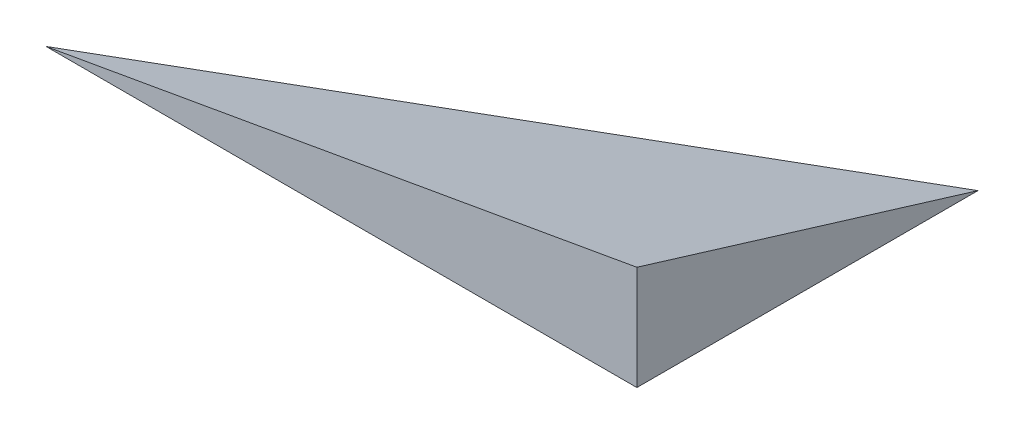
ISO-10303-21;
HEADER;
FILE_DESCRIPTION(('STEP AP214'),'2;1');
FILE_NAME('part.step','',(''),(''),'','','');
FILE_SCHEMA(('AUTOMOTIVE_DESIGN { 1 0 10303 214 1 1 1 1 }'));
ENDSEC;
DATA;
#1=APPLICATION_CONTEXT('core data for automotive mechanical design processes');
#2=APPLICATION_PROTOCOL_DEFINITION('international standard','automotive_design',2000,#1);
#3=PRODUCT_CONTEXT('',#1,'mechanical');
#4=PRODUCT('Part','Part','',(#3));
#5=PRODUCT_RELATED_PRODUCT_CATEGORY('part','',(#4));
#6=PRODUCT_DEFINITION_FORMATION('','',#4);
#7=PRODUCT_DEFINITION_CONTEXT('part definition',#1,'design');
#8=PRODUCT_DEFINITION('design','',#6,#7);
#9=PRODUCT_DEFINITION_SHAPE('','',#8);
#10=(LENGTH_UNIT() NAMED_UNIT(*) SI_UNIT(.MILLI.,.METRE.));
#11=(NAMED_UNIT(*) PLANE_ANGLE_UNIT() SI_UNIT($,.RADIAN.));
#12=(NAMED_UNIT(*) SI_UNIT($,.STERADIAN.) SOLID_ANGLE_UNIT());
#13=UNCERTAINTY_MEASURE_WITH_UNIT(LENGTH_MEASURE(1.E-05),#10,'distance_accuracy_value','');
#14=(GEOMETRIC_REPRESENTATION_CONTEXT(3) GLOBAL_UNCERTAINTY_ASSIGNED_CONTEXT((#13)) GLOBAL_UNIT_ASSIGNED_CONTEXT((#10,
#11,#12)) REPRESENTATION_CONTEXT('',''));
#15=CARTESIAN_POINT('',(0.,0.,0.));
#16=DIRECTION('',(0.,0.,1.));
#17=DIRECTION('',(1.,0.,0.));
#18=AXIS2_PLACEMENT_3D('',#15,#16,#17);
#19=CARTESIAN_POINT('',(0.,0.,0.));
#20=DIRECTION('',(0.,0.,-1.));
#21=DIRECTION('',(-1.,0.,0.));
#22=AXIS2_PLACEMENT_3D('',#19,#20,#21);
#23=PLANE('',#22);
#24=DIRECTION('',(1.,0.,0.));
#25=VECTOR('',#24,1.);
#26=CARTESIAN_POINT('',(0.,0.,0.));
#27=LINE('',#26,#25);
#28=CARTESIAN_POINT('',(0.,0.,0.));
#29=VERTEX_POINT('',#28);
#30=CARTESIAN_POINT('',(270.822132078357,0.,0.));
#31=VERTEX_POINT('',#30);
#32=EDGE_CURVE('E62',#29,#31,#27,.T.);
#33=ORIENTED_EDGE('',*,*,#32,.T.);
#34=DIRECTION('',(0.,1.,0.));
#35=VECTOR('',#34,1.);
#36=CARTESIAN_POINT('',(270.822132078357,47.753248858406,0.));
#37=LINE('',#36,#35);
#38=CARTESIAN_POINT('',(270.822132078357,47.753248858406,0.));
#39=VERTEX_POINT('',#38);
#40=EDGE_CURVE('E55',#31,#39,#37,.T.);
#41=ORIENTED_EDGE('',*,*,#40,.T.);
#42=DIRECTION('',(-0.984807753012208,-0.173648177666931,0.));
#43=VECTOR('',#42,1.);
#44=CARTESIAN_POINT('',(0.,0.,0.));
#45=LINE('',#44,#43);
#46=EDGE_CURVE('E12',#39,#29,#45,.T.);
#47=ORIENTED_EDGE('',*,*,#46,.T.);
#48=EDGE_LOOP('',(#33,#41,#47));
#49=FACE_BOUND('',#48,.T.);
#50=ADVANCED_FACE('F45',(#49),#23,.F.);
#51=CARTESIAN_POINT('',(0.,0.,0.));
#52=DIRECTION('',(0.,1.,0.));
#53=DIRECTION('',(0.,0.,1.));
#54=AXIS2_PLACEMENT_3D('',#51,#52,#53);
#55=PLANE('',#54);
#56=ORIENTED_EDGE('',*,*,#32,.F.);
#57=DIRECTION('',(-0.866025403784441,0.,0.499999999999995));
#58=VECTOR('',#57,1.);
#59=CARTESIAN_POINT('',(270.822132078357,0.,-156.359230857946));
#60=LINE('',#59,#58);
#61=CARTESIAN_POINT('',(270.822132078357,0.,-156.359230857946));
#62=VERTEX_POINT('',#61);
#63=EDGE_CURVE('E72',#62,#29,#60,.T.);
#64=ORIENTED_EDGE('',*,*,#63,.F.);
#65=DIRECTION('',(0.,0.,-1.));
#66=VECTOR('',#65,1.);
#67=CARTESIAN_POINT('',(270.822132078357,0.,0.));
#68=LINE('',#67,#66);
#69=EDGE_CURVE('E76',#31,#62,#68,.T.);
#70=ORIENTED_EDGE('',*,*,#69,.F.);
#71=EDGE_LOOP('',(#56,#64,#70));
#72=FACE_BOUND('',#71,.T.);
#73=ADVANCED_FACE('F75',(#72),#55,.F.);
#74=CARTESIAN_POINT('',(270.822132078357,0.,-156.359230857946));
#75=DIRECTION('',(-0.166289622503351,0.943075312894346,-0.288022074947257));
#76=DIRECTION('',(-0.866025403784441,0.,0.499999999999995));
#77=AXIS2_PLACEMENT_3D('',#74,#75,#76);
#78=PLANE('',#77);
#79=ORIENTED_EDGE('',*,*,#63,.T.);
#80=ORIENTED_EDGE('',*,*,#46,.F.);
#81=DIRECTION('',(0.,-0.292088840984949,-0.95639119034633));
#82=VECTOR('',#81,1.);
#83=CARTESIAN_POINT('',(270.822132078357,23.876624429203,-78.1796154289729));
#84=LINE('',#83,#82);
#85=EDGE_CURVE('E82',#39,#62,#84,.T.);
#86=ORIENTED_EDGE('',*,*,#85,.T.);
#87=EDGE_LOOP('',(#79,#80,#86));
#88=FACE_BOUND('',#87,.T.);
#89=ADVANCED_FACE('F96',(#88),#78,.T.);
#90=CARTESIAN_POINT('',(270.822132078357,0.,0.));
#91=DIRECTION('',(1.,0.,0.));
#92=DIRECTION('',(0.,0.,-1.));
#93=AXIS2_PLACEMENT_3D('',#90,#91,#92);
#94=PLANE('',#93);
#95=ORIENTED_EDGE('',*,*,#69,.T.);
#96=ORIENTED_EDGE('',*,*,#85,.F.);
#97=ORIENTED_EDGE('',*,*,#40,.F.);
#98=EDGE_LOOP('',(#95,#96,#97));
#99=FACE_BOUND('',#98,.T.);
#100=ADVANCED_FACE('F89',(#99),#94,.T.);
#101=CLOSED_SHELL('',(#50,#73,#89,#100));
#102=MANIFOLD_SOLID_BREP('B2',#101);
#103=ADVANCED_BREP_SHAPE_REPRESENTATION('',(#18,#102),#14);
#104=SHAPE_DEFINITION_REPRESENTATION(#9,#103);
ENDSEC;
END-ISO-10303-21;
